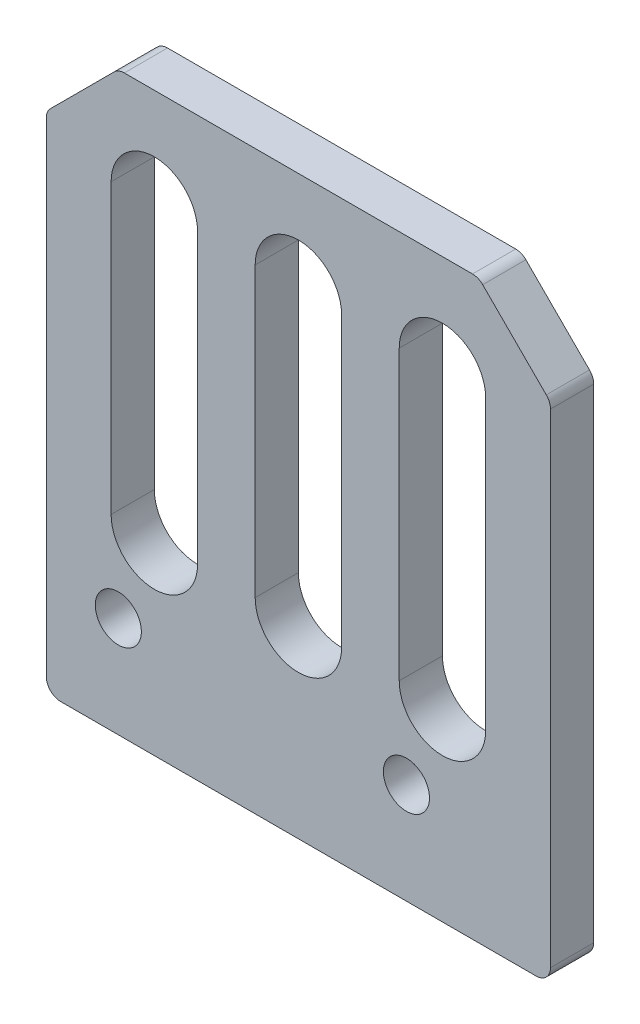
ISO-10303-21;
HEADER;
FILE_DESCRIPTION(('STEP AP214'),'2;1');
FILE_NAME('part.step','',(''),(''),'','','');
FILE_SCHEMA(('AUTOMOTIVE_DESIGN { 1 0 10303 214 1 1 1 1 }'));
ENDSEC;
DATA;
#1=APPLICATION_CONTEXT('core data for automotive mechanical design processes');
#2=APPLICATION_PROTOCOL_DEFINITION('international standard','automotive_design',2000,#1);
#3=PRODUCT_CONTEXT('',#1,'mechanical');
#4=PRODUCT('Part','Part','',(#3));
#5=PRODUCT_RELATED_PRODUCT_CATEGORY('part','',(#4));
#6=PRODUCT_DEFINITION_FORMATION('','',#4);
#7=PRODUCT_DEFINITION_CONTEXT('part definition',#1,'design');
#8=PRODUCT_DEFINITION('design','',#6,#7);
#9=PRODUCT_DEFINITION_SHAPE('','',#8);
#10=(LENGTH_UNIT() NAMED_UNIT(*) SI_UNIT(.MILLI.,.METRE.));
#11=(NAMED_UNIT(*) PLANE_ANGLE_UNIT() SI_UNIT($,.RADIAN.));
#12=(NAMED_UNIT(*) SI_UNIT($,.STERADIAN.) SOLID_ANGLE_UNIT());
#13=UNCERTAINTY_MEASURE_WITH_UNIT(LENGTH_MEASURE(1.E-05),#10,'distance_accuracy_value','');
#14=(GEOMETRIC_REPRESENTATION_CONTEXT(3) GLOBAL_UNCERTAINTY_ASSIGNED_CONTEXT((#13)) GLOBAL_UNIT_ASSIGNED_CONTEXT((#10,
#11,#12)) REPRESENTATION_CONTEXT('',''));
#15=CARTESIAN_POINT('',(0.,0.,0.));
#16=DIRECTION('',(0.,0.,1.));
#17=DIRECTION('',(1.,0.,0.));
#18=AXIS2_PLACEMENT_3D('',#15,#16,#17);
#19=CARTESIAN_POINT('',(17.5,20.,3.));
#20=DIRECTION('',(-1.,0.,0.));
#21=DIRECTION('',(0.,-1.,0.));
#22=AXIS2_PLACEMENT_3D('',#19,#20,#21);
#23=PLANE('',#22);
#24=DIRECTION('',(0.,1.,0.));
#25=VECTOR('',#24,1.);
#26=CARTESIAN_POINT('',(17.5,20.,0.));
#27=LINE('',#26,#25);
#28=CARTESIAN_POINT('',(17.5,-19.,0.));
#29=VERTEX_POINT('',#28);
#30=CARTESIAN_POINT('',(17.5,14.5857864376269,0.));
#31=VERTEX_POINT('',#30);
#32=EDGE_CURVE('E346',#29,#31,#27,.T.);
#33=ORIENTED_EDGE('',*,*,#32,.T.);
#34=DIRECTION('',(0.,0.,-1.));
#35=VECTOR('',#34,1.);
#36=CARTESIAN_POINT('',(17.5,14.5857864376269,3.));
#37=LINE('',#36,#35);
#38=CARTESIAN_POINT('',(17.5,14.5857864376269,3.));
#39=VERTEX_POINT('',#38);
#40=EDGE_CURVE('E459',#31,#39,#37,.F.);
#41=ORIENTED_EDGE('',*,*,#40,.T.);
#42=DIRECTION('',(0.,1.,0.));
#43=VECTOR('',#42,1.);
#44=CARTESIAN_POINT('',(17.5,20.,3.));
#45=LINE('',#44,#43);
#46=CARTESIAN_POINT('',(17.5,-19.,3.));
#47=VERTEX_POINT('',#46);
#48=EDGE_CURVE('E358',#47,#39,#45,.T.);
#49=ORIENTED_EDGE('',*,*,#48,.F.);
#50=DIRECTION('',(0.,0.,-1.));
#51=VECTOR('',#50,1.);
#52=CARTESIAN_POINT('',(17.5,-19.,3.));
#53=LINE('',#52,#51);
#54=EDGE_CURVE('E455',#47,#29,#53,.T.);
#55=ORIENTED_EDGE('',*,*,#54,.T.);
#56=EDGE_LOOP('',(#33,#41,#49,#55));
#57=FACE_BOUND('',#56,.T.);
#58=ADVANCED_FACE('F42',(#57),#23,.F.);
#59=CARTESIAN_POINT('',(-17.5,20.,3.));
#60=DIRECTION('',(0.,-1.,0.));
#61=DIRECTION('',(0.,0.,-1.));
#62=AXIS2_PLACEMENT_3D('',#59,#60,#61);
#63=PLANE('',#62);
#64=DIRECTION('',(-1.,0.,0.));
#65=VECTOR('',#64,1.);
#66=CARTESIAN_POINT('',(-17.5,20.,3.));
#67=LINE('',#66,#65);
#68=CARTESIAN_POINT('',(12.0857864376269,20.,3.));
#69=VERTEX_POINT('',#68);
#70=CARTESIAN_POINT('',(-12.0857864376269,20.,3.));
#71=VERTEX_POINT('',#70);
#72=EDGE_CURVE('E362',#69,#71,#67,.T.);
#73=ORIENTED_EDGE('',*,*,#72,.F.);
#74=DIRECTION('',(0.,0.,1.));
#75=VECTOR('',#74,1.);
#76=CARTESIAN_POINT('',(12.0857864376269,20.,0.));
#77=LINE('',#76,#75);
#78=CARTESIAN_POINT('',(12.0857864376269,20.,0.));
#79=VERTEX_POINT('',#78);
#80=EDGE_CURVE('E409',#69,#79,#77,.F.);
#81=ORIENTED_EDGE('',*,*,#80,.T.);
#82=DIRECTION('',(-1.,0.,0.));
#83=VECTOR('',#82,1.);
#84=CARTESIAN_POINT('',(-17.5,20.,0.));
#85=LINE('',#84,#83);
#86=CARTESIAN_POINT('',(-12.0857864376269,20.,0.));
#87=VERTEX_POINT('',#86);
#88=EDGE_CURVE('E379',#79,#87,#85,.T.);
#89=ORIENTED_EDGE('',*,*,#88,.T.);
#90=DIRECTION('',(0.,0.,-1.));
#91=VECTOR('',#90,1.);
#92=CARTESIAN_POINT('',(-12.0857864376269,20.,3.));
#93=LINE('',#92,#91);
#94=EDGE_CURVE('E405',#87,#71,#93,.F.);
#95=ORIENTED_EDGE('',*,*,#94,.T.);
#96=EDGE_LOOP('',(#73,#81,#89,#95));
#97=FACE_BOUND('',#96,.T.);
#98=ADVANCED_FACE('F493',(#97),#63,.F.);
#99=CARTESIAN_POINT('',(-17.5,20.,3.));
#100=DIRECTION('',(1.,0.,0.));
#101=DIRECTION('',(0.,1.,0.));
#102=AXIS2_PLACEMENT_3D('',#99,#100,#101);
#103=PLANE('',#102);
#104=DIRECTION('',(0.,-1.,0.));
#105=VECTOR('',#104,1.);
#106=CARTESIAN_POINT('',(-17.5,20.,3.));
#107=LINE('',#106,#105);
#108=CARTESIAN_POINT('',(-17.5,14.5857864376269,3.));
#109=VERTEX_POINT('',#108);
#110=CARTESIAN_POINT('',(-17.5,-19.,3.));
#111=VERTEX_POINT('',#110);
#112=EDGE_CURVE('E367',#109,#111,#107,.T.);
#113=ORIENTED_EDGE('',*,*,#112,.F.);
#114=DIRECTION('',(0.,0.,1.));
#115=VECTOR('',#114,1.);
#116=CARTESIAN_POINT('',(-17.5,14.5857864376269,0.));
#117=LINE('',#116,#115);
#118=CARTESIAN_POINT('',(-17.5,14.5857864376269,0.));
#119=VERTEX_POINT('',#118);
#120=EDGE_CURVE('E473',#109,#119,#117,.F.);
#121=ORIENTED_EDGE('',*,*,#120,.T.);
#122=DIRECTION('',(0.,-1.,0.));
#123=VECTOR('',#122,1.);
#124=CARTESIAN_POINT('',(-17.5,20.,0.));
#125=LINE('',#124,#123);
#126=CARTESIAN_POINT('',(-17.5,-19.,0.));
#127=VERTEX_POINT('',#126);
#128=EDGE_CURVE('E383',#119,#127,#125,.T.);
#129=ORIENTED_EDGE('',*,*,#128,.T.);
#130=DIRECTION('',(0.,0.,-1.));
#131=VECTOR('',#130,1.);
#132=CARTESIAN_POINT('',(-17.5,-19.,3.));
#133=LINE('',#132,#131);
#134=EDGE_CURVE('E470',#127,#111,#133,.F.);
#135=ORIENTED_EDGE('',*,*,#134,.T.);
#136=EDGE_LOOP('',(#113,#121,#129,#135));
#137=FACE_BOUND('',#136,.T.);
#138=ADVANCED_FACE('F528',(#137),#103,.F.);
#139=CARTESIAN_POINT('',(-17.5,-20.,3.));
#140=DIRECTION('',(0.,1.,0.));
#141=DIRECTION('',(0.,0.,1.));
#142=AXIS2_PLACEMENT_3D('',#139,#140,#141);
#143=PLANE('',#142);
#144=DIRECTION('',(1.,0.,0.));
#145=VECTOR('',#144,1.);
#146=CARTESIAN_POINT('',(-17.5,-20.,0.));
#147=LINE('',#146,#145);
#148=CARTESIAN_POINT('',(-16.5,-20.,0.));
#149=VERTEX_POINT('',#148);
#150=CARTESIAN_POINT('',(16.5,-20.,0.));
#151=VERTEX_POINT('',#150);
#152=EDGE_CURVE('E363',#149,#151,#147,.T.);
#153=ORIENTED_EDGE('',*,*,#152,.T.);
#154=DIRECTION('',(0.,0.,-1.));
#155=VECTOR('',#154,1.);
#156=CARTESIAN_POINT('',(16.5,-20.,3.));
#157=LINE('',#156,#155);
#158=CARTESIAN_POINT('',(16.5,-20.,3.));
#159=VERTEX_POINT('',#158);
#160=EDGE_CURVE('E467',#151,#159,#157,.F.);
#161=ORIENTED_EDGE('',*,*,#160,.T.);
#162=DIRECTION('',(1.,0.,0.));
#163=VECTOR('',#162,1.);
#164=CARTESIAN_POINT('',(-17.5,-20.,3.));
#165=LINE('',#164,#163);
#166=CARTESIAN_POINT('',(-16.5,-20.,3.));
#167=VERTEX_POINT('',#166);
#168=EDGE_CURVE('E371',#167,#159,#165,.T.);
#169=ORIENTED_EDGE('',*,*,#168,.F.);
#170=DIRECTION('',(0.,0.,-1.));
#171=VECTOR('',#170,1.);
#172=CARTESIAN_POINT('',(-16.5,-20.,3.));
#173=LINE('',#172,#171);
#174=EDGE_CURVE('E463',#167,#149,#173,.T.);
#175=ORIENTED_EDGE('',*,*,#174,.T.);
#176=EDGE_LOOP('',(#153,#161,#169,#175));
#177=FACE_BOUND('',#176,.T.);
#178=ADVANCED_FACE('F520',(#177),#143,.F.);
#179=CARTESIAN_POINT('',(0.,0.,3.));
#180=DIRECTION('',(0.,0.,1.));
#181=DIRECTION('',(1.,0.,0.));
#182=AXIS2_PLACEMENT_3D('',#179,#180,#181);
#183=PLANE('',#182);
#184=CARTESIAN_POINT('',(10.,13.,3.));
#185=DIRECTION('',(0.,0.,1.));
#186=DIRECTION('',(1.,0.,0.));
#187=AXIS2_PLACEMENT_3D('',#184,#185,#186);
#188=CIRCLE('',#187,3.00000000000001);
#189=CARTESIAN_POINT('',(13.,13.,3.));
#190=VERTEX_POINT('',#189);
#191=CARTESIAN_POINT('',(6.99999999999999,13.,3.));
#192=VERTEX_POINT('',#191);
#193=EDGE_CURVE('E58',#190,#192,#188,.T.);
#194=ORIENTED_EDGE('',*,*,#193,.F.);
#195=DIRECTION('',(0.,1.,0.));
#196=VECTOR('',#195,1.);
#197=CARTESIAN_POINT('',(13.,13.,3.));
#198=LINE('',#197,#196);
#199=CARTESIAN_POINT('',(13.,-7.,3.));
#200=VERTEX_POINT('',#199);
#201=EDGE_CURVE('E262',#200,#190,#198,.T.);
#202=ORIENTED_EDGE('',*,*,#201,.F.);
#203=CARTESIAN_POINT('',(10.,-7.,3.));
#204=DIRECTION('',(0.,0.,1.));
#205=DIRECTION('',(1.,0.,0.));
#206=AXIS2_PLACEMENT_3D('',#203,#204,#205);
#207=CIRCLE('',#206,3.00000000000001);
#208=CARTESIAN_POINT('',(6.99999999999999,-7.,3.));
#209=VERTEX_POINT('',#208);
#210=EDGE_CURVE('E281',#209,#200,#207,.T.);
#211=ORIENTED_EDGE('',*,*,#210,.F.);
#212=DIRECTION('',(0.,-1.,0.));
#213=VECTOR('',#212,1.);
#214=CARTESIAN_POINT('',(6.99999999999999,13.,3.));
#215=LINE('',#214,#213);
#216=EDGE_CURVE('E277',#192,#209,#215,.T.);
#217=ORIENTED_EDGE('',*,*,#216,.F.);
#218=EDGE_LOOP('',(#194,#202,#211,#217));
#219=FACE_BOUND('',#218,.T.);
#220=CARTESIAN_POINT('',(-10.,13.,3.));
#221=DIRECTION('',(0.,0.,1.));
#222=DIRECTION('',(1.,0.,0.));
#223=AXIS2_PLACEMENT_3D('',#220,#221,#222);
#224=CIRCLE('',#223,3.);
#225=CARTESIAN_POINT('',(-7.,13.,3.));
#226=VERTEX_POINT('',#225);
#227=CARTESIAN_POINT('',(-13.,13.,3.));
#228=VERTEX_POINT('',#227);
#229=EDGE_CURVE('E66',#226,#228,#224,.T.);
#230=ORIENTED_EDGE('',*,*,#229,.F.);
#231=DIRECTION('',(0.,1.,0.));
#232=VECTOR('',#231,1.);
#233=CARTESIAN_POINT('',(-7.,13.,3.));
#234=LINE('',#233,#232);
#235=CARTESIAN_POINT('',(-7.,-7.,3.));
#236=VERTEX_POINT('',#235);
#237=EDGE_CURVE('E227',#236,#226,#234,.T.);
#238=ORIENTED_EDGE('',*,*,#237,.F.);
#239=CARTESIAN_POINT('',(-10.,-7.,3.));
#240=DIRECTION('',(0.,0.,1.));
#241=DIRECTION('',(1.,0.,0.));
#242=AXIS2_PLACEMENT_3D('',#239,#240,#241);
#243=CIRCLE('',#242,3.);
#244=CARTESIAN_POINT('',(-13.,-7.,3.));
#245=VERTEX_POINT('',#244);
#246=EDGE_CURVE('E232',#245,#236,#243,.T.);
#247=ORIENTED_EDGE('',*,*,#246,.F.);
#248=DIRECTION('',(0.,-1.,0.));
#249=VECTOR('',#248,1.);
#250=CARTESIAN_POINT('',(-13.,13.,3.));
#251=LINE('',#250,#249);
#252=EDGE_CURVE('E241',#228,#245,#251,.T.);
#253=ORIENTED_EDGE('',*,*,#252,.F.);
#254=EDGE_LOOP('',(#230,#238,#247,#253));
#255=FACE_BOUND('',#254,.T.);
#256=CARTESIAN_POINT('',(0.,13.,3.));
#257=DIRECTION('',(0.,0.,1.));
#258=DIRECTION('',(1.,0.,0.));
#259=AXIS2_PLACEMENT_3D('',#256,#257,#258);
#260=CIRCLE('',#259,3.);
#261=CARTESIAN_POINT('',(3.,13.,3.));
#262=VERTEX_POINT('',#261);
#263=CARTESIAN_POINT('',(-3.,13.,3.));
#264=VERTEX_POINT('',#263);
#265=EDGE_CURVE('E251',#262,#264,#260,.T.);
#266=ORIENTED_EDGE('',*,*,#265,.F.);
#267=DIRECTION('',(0.,1.,0.));
#268=VECTOR('',#267,1.);
#269=CARTESIAN_POINT('',(3.,13.,3.));
#270=LINE('',#269,#268);
#271=CARTESIAN_POINT('',(3.,-7.,3.));
#272=VERTEX_POINT('',#271);
#273=EDGE_CURVE('E303',#272,#262,#270,.T.);
#274=ORIENTED_EDGE('',*,*,#273,.F.);
#275=CARTESIAN_POINT('',(0.,-7.,3.));
#276=DIRECTION('',(0.,0.,1.));
#277=DIRECTION('',(1.,0.,0.));
#278=AXIS2_PLACEMENT_3D('',#275,#276,#277);
#279=CIRCLE('',#278,3.);
#280=CARTESIAN_POINT('',(-3.,-7.,3.));
#281=VERTEX_POINT('',#280);
#282=EDGE_CURVE('E322',#281,#272,#279,.T.);
#283=ORIENTED_EDGE('',*,*,#282,.F.);
#284=DIRECTION('',(0.,-1.,0.));
#285=VECTOR('',#284,1.);
#286=CARTESIAN_POINT('',(-3.,13.,3.));
#287=LINE('',#286,#285);
#288=EDGE_CURVE('E318',#264,#281,#287,.T.);
#289=ORIENTED_EDGE('',*,*,#288,.F.);
#290=EDGE_LOOP('',(#266,#274,#283,#289));
#291=FACE_BOUND('',#290,.T.);
#292=CARTESIAN_POINT('',(-12.5,-13.,3.));
#293=DIRECTION('',(0.,0.,1.));
#294=DIRECTION('',(1.,0.,0.));
#295=AXIS2_PLACEMENT_3D('',#292,#293,#294);
#296=CIRCLE('',#295,1.6);
#297=CARTESIAN_POINT('',(-10.9,-13.,3.));
#298=VERTEX_POINT('',#297);
#299=EDGE_CURVE('E347',#298,#298,#296,.T.);
#300=ORIENTED_EDGE('',*,*,#299,.F.);
#301=EDGE_LOOP('',(#300));
#302=FACE_BOUND('',#301,.T.);
#303=CARTESIAN_POINT('',(7.5,-13.,3.));
#304=DIRECTION('',(0.,0.,1.));
#305=DIRECTION('',(1.,0.,0.));
#306=AXIS2_PLACEMENT_3D('',#303,#304,#305);
#307=CIRCLE('',#306,1.6);
#308=CARTESIAN_POINT('',(9.1,-13.,3.));
#309=VERTEX_POINT('',#308);
#310=EDGE_CURVE('E332',#309,#309,#307,.T.);
#311=ORIENTED_EDGE('',*,*,#310,.F.);
#312=EDGE_LOOP('',(#311));
#313=FACE_BOUND('',#312,.T.);
#314=DIRECTION('',(0.707106781186546,-0.707106781186549,0.));
#315=VECTOR('',#314,1.);
#316=CARTESIAN_POINT('',(16.25,16.25,3.));
#317=LINE('',#316,#315);
#318=CARTESIAN_POINT('',(17.2071067811865,15.2928932188134,3.));
#319=VERTEX_POINT('',#318);
#320=CARTESIAN_POINT('',(12.7928932188135,19.7071067811865,3.));
#321=VERTEX_POINT('',#320);
#322=EDGE_CURVE('E397',#319,#321,#317,.F.);
#323=ORIENTED_EDGE('',*,*,#322,.T.);
#324=CARTESIAN_POINT('',(12.0857864376269,19.,3.));
#325=DIRECTION('',(0.,0.,1.));
#326=DIRECTION('',(1.,0.,0.));
#327=AXIS2_PLACEMENT_3D('',#324,#325,#326);
#328=CIRCLE('',#327,1.);
#329=EDGE_CURVE('E452',#321,#69,#328,.T.);
#330=ORIENTED_EDGE('',*,*,#329,.T.);
#331=ORIENTED_EDGE('',*,*,#72,.T.);
#332=CARTESIAN_POINT('',(-12.0857864376269,19.,3.));
#333=DIRECTION('',(0.,0.,1.));
#334=DIRECTION('',(1.,0.,0.));
#335=AXIS2_PLACEMENT_3D('',#332,#333,#334);
#336=CIRCLE('',#335,1.);
#337=CARTESIAN_POINT('',(-12.7928932188134,19.7071067811865,3.));
#338=VERTEX_POINT('',#337);
#339=EDGE_CURVE('E440',#71,#338,#336,.T.);
#340=ORIENTED_EDGE('',*,*,#339,.T.);
#341=DIRECTION('',(0.707106781186549,0.707106781186546,0.));
#342=VECTOR('',#341,1.);
#343=CARTESIAN_POINT('',(-16.25,16.25,3.));
#344=LINE('',#343,#342);
#345=CARTESIAN_POINT('',(-17.2071067811865,15.2928932188134,3.));
#346=VERTEX_POINT('',#345);
#347=EDGE_CURVE('E401',#338,#346,#344,.F.);
#348=ORIENTED_EDGE('',*,*,#347,.T.);
#349=CARTESIAN_POINT('',(-16.5,14.5857864376269,3.));
#350=DIRECTION('',(0.,0.,1.));
#351=DIRECTION('',(1.,0.,0.));
#352=AXIS2_PLACEMENT_3D('',#349,#350,#351);
#353=CIRCLE('',#352,1.);
#354=EDGE_CURVE('E443',#346,#109,#353,.T.);
#355=ORIENTED_EDGE('',*,*,#354,.T.);
#356=ORIENTED_EDGE('',*,*,#112,.T.);
#357=CARTESIAN_POINT('',(-16.5,-19.,3.));
#358=DIRECTION('',(0.,0.,1.));
#359=DIRECTION('',(1.,0.,0.));
#360=AXIS2_PLACEMENT_3D('',#357,#358,#359);
#361=CIRCLE('',#360,1.);
#362=EDGE_CURVE('E437',#111,#167,#361,.T.);
#363=ORIENTED_EDGE('',*,*,#362,.T.);
#364=ORIENTED_EDGE('',*,*,#168,.T.);
#365=CARTESIAN_POINT('',(16.5,-19.,3.));
#366=DIRECTION('',(0.,0.,1.));
#367=DIRECTION('',(1.,0.,0.));
#368=AXIS2_PLACEMENT_3D('',#365,#366,#367);
#369=CIRCLE('',#368,1.);
#370=EDGE_CURVE('E446',#159,#47,#369,.T.);
#371=ORIENTED_EDGE('',*,*,#370,.T.);
#372=ORIENTED_EDGE('',*,*,#48,.T.);
#373=CARTESIAN_POINT('',(16.5,14.5857864376269,3.));
#374=DIRECTION('',(0.,0.,1.));
#375=DIRECTION('',(1.,0.,0.));
#376=AXIS2_PLACEMENT_3D('',#373,#374,#375);
#377=CIRCLE('',#376,1.);
#378=EDGE_CURVE('E449',#39,#319,#377,.T.);
#379=ORIENTED_EDGE('',*,*,#378,.T.);
#380=EDGE_LOOP('',(#323,#330,#331,#340,#348,#355,#356,#363,#364,#371,#372,#379));
#381=FACE_BOUND('',#380,.T.);
#382=ADVANCED_FACE('F496',(#219,#255,#291,#302,#313,#381),#183,.T.);
#383=CARTESIAN_POINT('',(0.,0.,0.));
#384=DIRECTION('',(0.,0.,1.));
#385=DIRECTION('',(1.,0.,0.));
#386=AXIS2_PLACEMENT_3D('',#383,#384,#385);
#387=PLANE('',#386);
#388=DIRECTION('',(0.,1.,0.));
#389=VECTOR('',#388,1.);
#390=CARTESIAN_POINT('',(13.,13.,0.));
#391=LINE('',#390,#389);
#392=CARTESIAN_POINT('',(13.,-7.,0.));
#393=VERTEX_POINT('',#392);
#394=CARTESIAN_POINT('',(13.,13.,0.));
#395=VERTEX_POINT('',#394);
#396=EDGE_CURVE('E270',#393,#395,#391,.T.);
#397=ORIENTED_EDGE('',*,*,#396,.T.);
#398=CARTESIAN_POINT('',(10.,13.,0.));
#399=DIRECTION('',(0.,0.,1.));
#400=DIRECTION('',(1.,0.,0.));
#401=AXIS2_PLACEMENT_3D('',#398,#399,#400);
#402=CIRCLE('',#401,3.00000000000001);
#403=CARTESIAN_POINT('',(6.99999999999999,13.,0.));
#404=VERTEX_POINT('',#403);
#405=EDGE_CURVE('E257',#395,#404,#402,.T.);
#406=ORIENTED_EDGE('',*,*,#405,.T.);
#407=DIRECTION('',(0.,-1.,0.));
#408=VECTOR('',#407,1.);
#409=CARTESIAN_POINT('',(6.99999999999999,13.,0.));
#410=LINE('',#409,#408);
#411=CARTESIAN_POINT('',(6.99999999999999,-7.,0.));
#412=VERTEX_POINT('',#411);
#413=EDGE_CURVE('E261',#404,#412,#410,.T.);
#414=ORIENTED_EDGE('',*,*,#413,.T.);
#415=CARTESIAN_POINT('',(10.,-7.,0.));
#416=DIRECTION('',(0.,0.,1.));
#417=DIRECTION('',(1.,0.,0.));
#418=AXIS2_PLACEMENT_3D('',#415,#416,#417);
#419=CIRCLE('',#418,3.00000000000001);
#420=EDGE_CURVE('E266',#412,#393,#419,.T.);
#421=ORIENTED_EDGE('',*,*,#420,.T.);
#422=EDGE_LOOP('',(#397,#406,#414,#421));
#423=FACE_BOUND('',#422,.T.);
#424=DIRECTION('',(0.,1.,0.));
#425=VECTOR('',#424,1.);
#426=CARTESIAN_POINT('',(-7.,13.,0.));
#427=LINE('',#426,#425);
#428=CARTESIAN_POINT('',(-7.,-7.,0.));
#429=VERTEX_POINT('',#428);
#430=CARTESIAN_POINT('',(-7.,13.,0.));
#431=VERTEX_POINT('',#430);
#432=EDGE_CURVE('E212',#429,#431,#427,.T.);
#433=ORIENTED_EDGE('',*,*,#432,.T.);
#434=CARTESIAN_POINT('',(-10.,13.,0.));
#435=DIRECTION('',(0.,0.,1.));
#436=DIRECTION('',(1.,0.,0.));
#437=AXIS2_PLACEMENT_3D('',#434,#435,#436);
#438=CIRCLE('',#437,3.);
#439=CARTESIAN_POINT('',(-13.,13.,0.));
#440=VERTEX_POINT('',#439);
#441=EDGE_CURVE('E205',#431,#440,#438,.T.);
#442=ORIENTED_EDGE('',*,*,#441,.T.);
#443=DIRECTION('',(0.,-1.,0.));
#444=VECTOR('',#443,1.);
#445=CARTESIAN_POINT('',(-13.,13.,0.));
#446=LINE('',#445,#444);
#447=CARTESIAN_POINT('',(-13.,-7.,0.));
#448=VERTEX_POINT('',#447);
#449=EDGE_CURVE('E216',#440,#448,#446,.T.);
#450=ORIENTED_EDGE('',*,*,#449,.T.);
#451=CARTESIAN_POINT('',(-10.,-7.,0.));
#452=DIRECTION('',(0.,0.,1.));
#453=DIRECTION('',(1.,0.,0.));
#454=AXIS2_PLACEMENT_3D('',#451,#452,#453);
#455=CIRCLE('',#454,3.);
#456=EDGE_CURVE('E221',#448,#429,#455,.T.);
#457=ORIENTED_EDGE('',*,*,#456,.T.);
#458=EDGE_LOOP('',(#433,#442,#450,#457));
#459=FACE_BOUND('',#458,.T.);
#460=DIRECTION('',(0.,1.,0.));
#461=VECTOR('',#460,1.);
#462=CARTESIAN_POINT('',(3.,13.,0.));
#463=LINE('',#462,#461);
#464=CARTESIAN_POINT('',(3.,-7.,0.));
#465=VERTEX_POINT('',#464);
#466=CARTESIAN_POINT('',(3.,13.,0.));
#467=VERTEX_POINT('',#466);
#468=EDGE_CURVE('E311',#465,#467,#463,.T.);
#469=ORIENTED_EDGE('',*,*,#468,.T.);
#470=CARTESIAN_POINT('',(0.,13.,0.));
#471=DIRECTION('',(0.,0.,1.));
#472=DIRECTION('',(1.,0.,0.));
#473=AXIS2_PLACEMENT_3D('',#470,#471,#472);
#474=CIRCLE('',#473,3.);
#475=CARTESIAN_POINT('',(-3.,13.,0.));
#476=VERTEX_POINT('',#475);
#477=EDGE_CURVE('E298',#467,#476,#474,.T.);
#478=ORIENTED_EDGE('',*,*,#477,.T.);
#479=DIRECTION('',(0.,-1.,0.));
#480=VECTOR('',#479,1.);
#481=CARTESIAN_POINT('',(-3.,13.,0.));
#482=LINE('',#481,#480);
#483=CARTESIAN_POINT('',(-3.,-7.,0.));
#484=VERTEX_POINT('',#483);
#485=EDGE_CURVE('E302',#476,#484,#482,.T.);
#486=ORIENTED_EDGE('',*,*,#485,.T.);
#487=CARTESIAN_POINT('',(0.,-7.,0.));
#488=DIRECTION('',(0.,0.,1.));
#489=DIRECTION('',(1.,0.,0.));
#490=AXIS2_PLACEMENT_3D('',#487,#488,#489);
#491=CIRCLE('',#490,3.);
#492=EDGE_CURVE('E307',#484,#465,#491,.T.);
#493=ORIENTED_EDGE('',*,*,#492,.T.);
#494=EDGE_LOOP('',(#469,#478,#486,#493));
#495=FACE_BOUND('',#494,.T.);
#496=CARTESIAN_POINT('',(-12.5,-13.,0.));
#497=DIRECTION('',(0.,0.,1.));
#498=DIRECTION('',(1.,0.,0.));
#499=AXIS2_PLACEMENT_3D('',#496,#497,#498);
#500=CIRCLE('',#499,1.6);
#501=CARTESIAN_POINT('',(-10.9,-13.,0.));
#502=VERTEX_POINT('',#501);
#503=EDGE_CURVE('E342',#502,#502,#500,.T.);
#504=ORIENTED_EDGE('',*,*,#503,.T.);
#505=EDGE_LOOP('',(#504));
#506=FACE_BOUND('',#505,.T.);
#507=CARTESIAN_POINT('',(7.5,-13.,0.));
#508=DIRECTION('',(0.,0.,1.));
#509=DIRECTION('',(1.,0.,0.));
#510=AXIS2_PLACEMENT_3D('',#507,#508,#509);
#511=CIRCLE('',#510,1.6);
#512=CARTESIAN_POINT('',(9.1,-13.,0.));
#513=VERTEX_POINT('',#512);
#514=EDGE_CURVE('E351',#513,#513,#511,.T.);
#515=ORIENTED_EDGE('',*,*,#514,.T.);
#516=EDGE_LOOP('',(#515));
#517=FACE_BOUND('',#516,.T.);
#518=ORIENTED_EDGE('',*,*,#88,.F.);
#519=CARTESIAN_POINT('',(12.0857864376269,19.,0.));
#520=DIRECTION('',(0.,0.,1.));
#521=DIRECTION('',(1.,0.,0.));
#522=AXIS2_PLACEMENT_3D('',#519,#520,#521);
#523=CIRCLE('',#522,1.);
#524=CARTESIAN_POINT('',(12.7928932188135,19.7071067811865,0.));
#525=VERTEX_POINT('',#524);
#526=EDGE_CURVE('E428',#79,#525,#523,.F.);
#527=ORIENTED_EDGE('',*,*,#526,.T.);
#528=DIRECTION('',(-0.707106781186546,0.707106781186549,0.));
#529=VECTOR('',#528,1.);
#530=CARTESIAN_POINT('',(12.5,20.,0.));
#531=LINE('',#530,#529);
#532=CARTESIAN_POINT('',(17.2071067811865,15.2928932188134,0.));
#533=VERTEX_POINT('',#532);
#534=EDGE_CURVE('E375',#525,#533,#531,.F.);
#535=ORIENTED_EDGE('',*,*,#534,.T.);
#536=CARTESIAN_POINT('',(16.5,14.5857864376269,0.));
#537=DIRECTION('',(0.,0.,1.));
#538=DIRECTION('',(1.,0.,0.));
#539=AXIS2_PLACEMENT_3D('',#536,#537,#538);
#540=CIRCLE('',#539,1.);
#541=EDGE_CURVE('E425',#533,#31,#540,.F.);
#542=ORIENTED_EDGE('',*,*,#541,.T.);
#543=ORIENTED_EDGE('',*,*,#32,.F.);
#544=CARTESIAN_POINT('',(16.5,-19.,0.));
#545=DIRECTION('',(0.,0.,1.));
#546=DIRECTION('',(1.,0.,0.));
#547=AXIS2_PLACEMENT_3D('',#544,#545,#546);
#548=CIRCLE('',#547,1.);
#549=EDGE_CURVE('E422',#29,#151,#548,.F.);
#550=ORIENTED_EDGE('',*,*,#549,.T.);
#551=ORIENTED_EDGE('',*,*,#152,.F.);
#552=CARTESIAN_POINT('',(-16.5,-19.,0.));
#553=DIRECTION('',(0.,0.,1.));
#554=DIRECTION('',(1.,0.,0.));
#555=AXIS2_PLACEMENT_3D('',#552,#553,#554);
#556=CIRCLE('',#555,1.);
#557=EDGE_CURVE('E413',#149,#127,#556,.F.);
#558=ORIENTED_EDGE('',*,*,#557,.T.);
#559=ORIENTED_EDGE('',*,*,#128,.F.);
#560=CARTESIAN_POINT('',(-16.5,14.5857864376269,0.));
#561=DIRECTION('',(0.,0.,1.));
#562=DIRECTION('',(1.,0.,0.));
#563=AXIS2_PLACEMENT_3D('',#560,#561,#562);
#564=CIRCLE('',#563,1.);
#565=CARTESIAN_POINT('',(-17.2071067811865,15.2928932188134,0.));
#566=VERTEX_POINT('',#565);
#567=EDGE_CURVE('E419',#119,#566,#564,.F.);
#568=ORIENTED_EDGE('',*,*,#567,.T.);
#569=DIRECTION('',(-0.707106781186549,-0.707106781186546,0.));
#570=VECTOR('',#569,1.);
#571=CARTESIAN_POINT('',(-17.5,15.,0.));
#572=LINE('',#571,#570);
#573=CARTESIAN_POINT('',(-12.7928932188134,19.7071067811865,0.));
#574=VERTEX_POINT('',#573);
#575=EDGE_CURVE('E393',#566,#574,#572,.F.);
#576=ORIENTED_EDGE('',*,*,#575,.T.);
#577=CARTESIAN_POINT('',(-12.0857864376269,19.,0.));
#578=DIRECTION('',(0.,0.,1.));
#579=DIRECTION('',(1.,0.,0.));
#580=AXIS2_PLACEMENT_3D('',#577,#578,#579);
#581=CIRCLE('',#580,1.);
#582=EDGE_CURVE('E416',#574,#87,#581,.F.);
#583=ORIENTED_EDGE('',*,*,#582,.T.);
#584=EDGE_LOOP('',(#518,#527,#535,#542,#543,#550,#551,#558,#559,#568,#576,#583));
#585=FACE_BOUND('',#584,.T.);
#586=ADVANCED_FACE('F223',(#423,#459,#495,#506,#517,#585),#387,.F.);
#587=CARTESIAN_POINT('',(-17.5,15.,3.));
#588=DIRECTION('',(0.707106781186546,-0.707106781186549,0.));
#589=DIRECTION('',(0.,0.,-1.));
#590=AXIS2_PLACEMENT_3D('',#587,#588,#589);
#591=PLANE('',#590);
#592=ORIENTED_EDGE('',*,*,#575,.F.);
#593=DIRECTION('',(0.,0.,-1.));
#594=VECTOR('',#593,1.);
#595=CARTESIAN_POINT('',(-17.2071067811865,15.2928932188134,3.));
#596=LINE('',#595,#594);
#597=EDGE_CURVE('E11',#566,#346,#596,.F.);
#598=ORIENTED_EDGE('',*,*,#597,.T.);
#599=ORIENTED_EDGE('',*,*,#347,.F.);
#600=DIRECTION('',(0.,0.,1.));
#601=VECTOR('',#600,1.);
#602=CARTESIAN_POINT('',(-12.7928932188134,19.7071067811865,0.));
#603=LINE('',#602,#601);
#604=EDGE_CURVE('E51',#338,#574,#603,.F.);
#605=ORIENTED_EDGE('',*,*,#604,.T.);
#606=EDGE_LOOP('',(#592,#598,#599,#605));
#607=FACE_BOUND('',#606,.T.);
#608=ADVANCED_FACE('F482',(#607),#591,.F.);
#609=CARTESIAN_POINT('',(12.5,20.,3.));
#610=DIRECTION('',(-0.707106781186549,-0.707106781186546,0.));
#611=DIRECTION('',(0.,0.,-1.));
#612=AXIS2_PLACEMENT_3D('',#609,#610,#611);
#613=PLANE('',#612);
#614=ORIENTED_EDGE('',*,*,#534,.F.);
#615=DIRECTION('',(0.,0.,-1.));
#616=VECTOR('',#615,1.);
#617=CARTESIAN_POINT('',(12.7928932188135,19.7071067811865,3.));
#618=LINE('',#617,#616);
#619=EDGE_CURVE('E434',#525,#321,#618,.F.);
#620=ORIENTED_EDGE('',*,*,#619,.T.);
#621=ORIENTED_EDGE('',*,*,#322,.F.);
#622=DIRECTION('',(0.,0.,1.));
#623=VECTOR('',#622,1.);
#624=CARTESIAN_POINT('',(17.2071067811865,15.2928932188134,0.));
#625=LINE('',#624,#623);
#626=EDGE_CURVE('E431',#319,#533,#625,.F.);
#627=ORIENTED_EDGE('',*,*,#626,.T.);
#628=EDGE_LOOP('',(#614,#620,#621,#627));
#629=FACE_BOUND('',#628,.T.);
#630=ADVANCED_FACE('F505',(#629),#613,.F.);
#631=CARTESIAN_POINT('',(12.0857864376269,19.,3.));
#632=DIRECTION('',(0.,0.,-1.));
#633=DIRECTION('',(-1.,0.,0.));
#634=AXIS2_PLACEMENT_3D('',#631,#632,#633);
#635=CYLINDRICAL_SURFACE('',#634,1.);
#636=ORIENTED_EDGE('',*,*,#329,.F.);
#637=ORIENTED_EDGE('',*,*,#619,.F.);
#638=ORIENTED_EDGE('',*,*,#526,.F.);
#639=ORIENTED_EDGE('',*,*,#80,.F.);
#640=EDGE_LOOP('',(#636,#637,#638,#639));
#641=FACE_BOUND('',#640,.T.);
#642=ADVANCED_FACE('F501',(#641),#635,.T.);
#643=CARTESIAN_POINT('',(16.5,14.5857864376269,3.));
#644=DIRECTION('',(0.,0.,1.));
#645=DIRECTION('',(1.,0.,0.));
#646=AXIS2_PLACEMENT_3D('',#643,#644,#645);
#647=CYLINDRICAL_SURFACE('',#646,1.);
#648=ORIENTED_EDGE('',*,*,#541,.F.);
#649=ORIENTED_EDGE('',*,*,#626,.F.);
#650=ORIENTED_EDGE('',*,*,#378,.F.);
#651=ORIENTED_EDGE('',*,*,#40,.F.);
#652=EDGE_LOOP('',(#648,#649,#650,#651));
#653=FACE_BOUND('',#652,.T.);
#654=ADVANCED_FACE('F508',(#653),#647,.T.);
#655=CARTESIAN_POINT('',(16.5,-19.,3.));
#656=DIRECTION('',(0.,0.,-1.));
#657=DIRECTION('',(-1.,0.,0.));
#658=AXIS2_PLACEMENT_3D('',#655,#656,#657);
#659=CYLINDRICAL_SURFACE('',#658,1.);
#660=ORIENTED_EDGE('',*,*,#370,.F.);
#661=ORIENTED_EDGE('',*,*,#160,.F.);
#662=ORIENTED_EDGE('',*,*,#549,.F.);
#663=ORIENTED_EDGE('',*,*,#54,.F.);
#664=EDGE_LOOP('',(#660,#661,#662,#663));
#665=FACE_BOUND('',#664,.T.);
#666=ADVANCED_FACE('F516',(#665),#659,.T.);
#667=CARTESIAN_POINT('',(-16.5,14.5857864376269,3.));
#668=DIRECTION('',(0.,0.,-1.));
#669=DIRECTION('',(-1.,0.,0.));
#670=AXIS2_PLACEMENT_3D('',#667,#668,#669);
#671=CYLINDRICAL_SURFACE('',#670,1.);
#672=ORIENTED_EDGE('',*,*,#354,.F.);
#673=ORIENTED_EDGE('',*,*,#597,.F.);
#674=ORIENTED_EDGE('',*,*,#567,.F.);
#675=ORIENTED_EDGE('',*,*,#120,.F.);
#676=EDGE_LOOP('',(#672,#673,#674,#675));
#677=FACE_BOUND('',#676,.T.);
#678=ADVANCED_FACE('F532',(#677),#671,.T.);
#679=CARTESIAN_POINT('',(-12.0857864376269,19.,3.));
#680=DIRECTION('',(0.,0.,1.));
#681=DIRECTION('',(1.,0.,0.));
#682=AXIS2_PLACEMENT_3D('',#679,#680,#681);
#683=CYLINDRICAL_SURFACE('',#682,1.);
#684=ORIENTED_EDGE('',*,*,#582,.F.);
#685=ORIENTED_EDGE('',*,*,#604,.F.);
#686=ORIENTED_EDGE('',*,*,#339,.F.);
#687=ORIENTED_EDGE('',*,*,#94,.F.);
#688=EDGE_LOOP('',(#684,#685,#686,#687));
#689=FACE_BOUND('',#688,.T.);
#690=ADVANCED_FACE('F490',(#689),#683,.T.);
#691=CARTESIAN_POINT('',(-16.5,-19.,3.));
#692=DIRECTION('',(0.,0.,-1.));
#693=DIRECTION('',(-1.,0.,0.));
#694=AXIS2_PLACEMENT_3D('',#691,#692,#693);
#695=CYLINDRICAL_SURFACE('',#694,1.);
#696=ORIENTED_EDGE('',*,*,#362,.F.);
#697=ORIENTED_EDGE('',*,*,#134,.F.);
#698=ORIENTED_EDGE('',*,*,#557,.F.);
#699=ORIENTED_EDGE('',*,*,#174,.F.);
#700=EDGE_LOOP('',(#696,#697,#698,#699));
#701=FACE_BOUND('',#700,.T.);
#702=ADVANCED_FACE('F44',(#701),#695,.T.);
#703=CARTESIAN_POINT('',(7.5,-13.,0.));
#704=DIRECTION('',(0.,0.,1.));
#705=DIRECTION('',(1.,0.,0.));
#706=AXIS2_PLACEMENT_3D('',#703,#704,#705);
#707=CYLINDRICAL_SURFACE('',#706,1.6);
#708=ORIENTED_EDGE('',*,*,#514,.F.);
#709=EDGE_LOOP('',(#708));
#710=FACE_BOUND('',#709,.T.);
#711=ORIENTED_EDGE('',*,*,#310,.T.);
#712=EDGE_LOOP('',(#711));
#713=FACE_BOUND('',#712,.T.);
#714=ADVANCED_FACE('F588',(#710,#713),#707,.F.);
#715=CARTESIAN_POINT('',(-12.5,-13.,0.));
#716=DIRECTION('',(0.,0.,1.));
#717=DIRECTION('',(1.,0.,0.));
#718=AXIS2_PLACEMENT_3D('',#715,#716,#717);
#719=CYLINDRICAL_SURFACE('',#718,1.6);
#720=ORIENTED_EDGE('',*,*,#503,.F.);
#721=EDGE_LOOP('',(#720));
#722=FACE_BOUND('',#721,.T.);
#723=ORIENTED_EDGE('',*,*,#299,.T.);
#724=EDGE_LOOP('',(#723));
#725=FACE_BOUND('',#724,.T.);
#726=ADVANCED_FACE('F596',(#722,#725),#719,.F.);
#727=CARTESIAN_POINT('',(0.,13.,0.));
#728=DIRECTION('',(0.,0.,1.));
#729=DIRECTION('',(1.,0.,0.));
#730=AXIS2_PLACEMENT_3D('',#727,#728,#729);
#731=CYLINDRICAL_SURFACE('',#730,3.);
#732=ORIENTED_EDGE('',*,*,#265,.T.);
#733=DIRECTION('',(0.,0.,1.));
#734=VECTOR('',#733,1.);
#735=CARTESIAN_POINT('',(-3.,13.,0.));
#736=LINE('',#735,#734);
#737=EDGE_CURVE('E315',#476,#264,#736,.T.);
#738=ORIENTED_EDGE('',*,*,#737,.F.);
#739=ORIENTED_EDGE('',*,*,#477,.F.);
#740=DIRECTION('',(0.,0.,1.));
#741=VECTOR('',#740,1.);
#742=CARTESIAN_POINT('',(3.,13.,0.));
#743=LINE('',#742,#741);
#744=EDGE_CURVE('E329',#467,#262,#743,.T.);
#745=ORIENTED_EDGE('',*,*,#744,.T.);
#746=EDGE_LOOP('',(#732,#738,#739,#745));
#747=FACE_BOUND('',#746,.T.);
#748=ADVANCED_FACE('F606',(#747),#731,.F.);
#749=CARTESIAN_POINT('',(3.,13.,0.));
#750=DIRECTION('',(1.,0.,0.));
#751=DIRECTION('',(0.,1.,0.));
#752=AXIS2_PLACEMENT_3D('',#749,#750,#751);
#753=PLANE('',#752);
#754=ORIENTED_EDGE('',*,*,#273,.T.);
#755=ORIENTED_EDGE('',*,*,#744,.F.);
#756=ORIENTED_EDGE('',*,*,#468,.F.);
#757=DIRECTION('',(0.,0.,1.));
#758=VECTOR('',#757,1.);
#759=CARTESIAN_POINT('',(3.,-7.,0.));
#760=LINE('',#759,#758);
#761=EDGE_CURVE('E333',#465,#272,#760,.T.);
#762=ORIENTED_EDGE('',*,*,#761,.T.);
#763=EDGE_LOOP('',(#754,#755,#756,#762));
#764=FACE_BOUND('',#763,.T.);
#765=ADVANCED_FACE('F617',(#764),#753,.F.);
#766=CARTESIAN_POINT('',(0.,-7.,0.));
#767=DIRECTION('',(0.,0.,1.));
#768=DIRECTION('',(1.,0.,0.));
#769=AXIS2_PLACEMENT_3D('',#766,#767,#768);
#770=CYLINDRICAL_SURFACE('',#769,3.);
#771=ORIENTED_EDGE('',*,*,#282,.T.);
#772=ORIENTED_EDGE('',*,*,#761,.F.);
#773=ORIENTED_EDGE('',*,*,#492,.F.);
#774=DIRECTION('',(0.,0.,1.));
#775=VECTOR('',#774,1.);
#776=CARTESIAN_POINT('',(-3.,-7.,0.));
#777=LINE('',#776,#775);
#778=EDGE_CURVE('E336',#484,#281,#777,.T.);
#779=ORIENTED_EDGE('',*,*,#778,.T.);
#780=EDGE_LOOP('',(#771,#772,#773,#779));
#781=FACE_BOUND('',#780,.T.);
#782=ADVANCED_FACE('F628',(#781),#770,.F.);
#783=CARTESIAN_POINT('',(-3.,13.,0.));
#784=DIRECTION('',(-1.,0.,0.));
#785=DIRECTION('',(0.,-1.,0.));
#786=AXIS2_PLACEMENT_3D('',#783,#784,#785);
#787=PLANE('',#786);
#788=ORIENTED_EDGE('',*,*,#288,.T.);
#789=ORIENTED_EDGE('',*,*,#778,.F.);
#790=ORIENTED_EDGE('',*,*,#485,.F.);
#791=ORIENTED_EDGE('',*,*,#737,.T.);
#792=EDGE_LOOP('',(#788,#789,#790,#791));
#793=FACE_BOUND('',#792,.T.);
#794=ADVANCED_FACE('F638',(#793),#787,.F.);
#795=CARTESIAN_POINT('',(-10.,13.,0.));
#796=DIRECTION('',(0.,0.,1.));
#797=DIRECTION('',(1.,0.,0.));
#798=AXIS2_PLACEMENT_3D('',#795,#796,#797);
#799=CYLINDRICAL_SURFACE('',#798,3.);
#800=ORIENTED_EDGE('',*,*,#229,.T.);
#801=DIRECTION('',(0.,0.,1.));
#802=VECTOR('',#801,1.);
#803=CARTESIAN_POINT('',(-13.,13.,0.));
#804=LINE('',#803,#802);
#805=EDGE_CURVE('E201',#440,#228,#804,.T.);
#806=ORIENTED_EDGE('',*,*,#805,.F.);
#807=ORIENTED_EDGE('',*,*,#441,.F.);
#808=DIRECTION('',(0.,0.,1.));
#809=VECTOR('',#808,1.);
#810=CARTESIAN_POINT('',(-7.,13.,0.));
#811=LINE('',#810,#809);
#812=EDGE_CURVE('E248',#431,#226,#811,.T.);
#813=ORIENTED_EDGE('',*,*,#812,.T.);
#814=EDGE_LOOP('',(#800,#806,#807,#813));
#815=FACE_BOUND('',#814,.T.);
#816=ADVANCED_FACE('F203',(#815),#799,.F.);
#817=CARTESIAN_POINT('',(-7.,13.,0.));
#818=DIRECTION('',(1.,0.,0.));
#819=DIRECTION('',(0.,0.,-1.));
#820=AXIS2_PLACEMENT_3D('',#817,#818,#819);
#821=PLANE('',#820);
#822=ORIENTED_EDGE('',*,*,#237,.T.);
#823=ORIENTED_EDGE('',*,*,#812,.F.);
#824=ORIENTED_EDGE('',*,*,#432,.F.);
#825=DIRECTION('',(0.,0.,1.));
#826=VECTOR('',#825,1.);
#827=CARTESIAN_POINT('',(-7.,-7.,0.));
#828=LINE('',#827,#826);
#829=EDGE_CURVE('E252',#429,#236,#828,.T.);
#830=ORIENTED_EDGE('',*,*,#829,.T.);
#831=EDGE_LOOP('',(#822,#823,#824,#830));
#832=FACE_BOUND('',#831,.T.);
#833=ADVANCED_FACE('F657',(#832),#821,.F.);
#834=CARTESIAN_POINT('',(-10.,-7.,0.));
#835=DIRECTION('',(0.,0.,1.));
#836=DIRECTION('',(1.,0.,0.));
#837=AXIS2_PLACEMENT_3D('',#834,#835,#836);
#838=CYLINDRICAL_SURFACE('',#837,3.);
#839=ORIENTED_EDGE('',*,*,#246,.T.);
#840=ORIENTED_EDGE('',*,*,#829,.F.);
#841=ORIENTED_EDGE('',*,*,#456,.F.);
#842=DIRECTION('',(0.,0.,1.));
#843=VECTOR('',#842,1.);
#844=CARTESIAN_POINT('',(-13.,-7.,0.));
#845=LINE('',#844,#843);
#846=EDGE_CURVE('E211',#448,#245,#845,.T.);
#847=ORIENTED_EDGE('',*,*,#846,.T.);
#848=EDGE_LOOP('',(#839,#840,#841,#847));
#849=FACE_BOUND('',#848,.T.);
#850=ADVANCED_FACE('F666',(#849),#838,.F.);
#851=CARTESIAN_POINT('',(-13.,13.,0.));
#852=DIRECTION('',(-1.,0.,0.));
#853=DIRECTION('',(0.,0.,1.));
#854=AXIS2_PLACEMENT_3D('',#851,#852,#853);
#855=PLANE('',#854);
#856=ORIENTED_EDGE('',*,*,#252,.T.);
#857=ORIENTED_EDGE('',*,*,#846,.F.);
#858=ORIENTED_EDGE('',*,*,#449,.F.);
#859=ORIENTED_EDGE('',*,*,#805,.T.);
#860=EDGE_LOOP('',(#856,#857,#858,#859));
#861=FACE_BOUND('',#860,.T.);
#862=ADVANCED_FACE('F217',(#861),#855,.F.);
#863=CARTESIAN_POINT('',(10.,13.,0.));
#864=DIRECTION('',(0.,0.,1.));
#865=DIRECTION('',(1.,0.,0.));
#866=AXIS2_PLACEMENT_3D('',#863,#864,#865);
#867=CYLINDRICAL_SURFACE('',#866,3.00000000000001);
#868=ORIENTED_EDGE('',*,*,#193,.T.);
#869=DIRECTION('',(0.,0.,1.));
#870=VECTOR('',#869,1.);
#871=CARTESIAN_POINT('',(6.99999999999999,13.,0.));
#872=LINE('',#871,#870);
#873=EDGE_CURVE('E274',#404,#192,#872,.T.);
#874=ORIENTED_EDGE('',*,*,#873,.F.);
#875=ORIENTED_EDGE('',*,*,#405,.F.);
#876=DIRECTION('',(0.,0.,1.));
#877=VECTOR('',#876,1.);
#878=CARTESIAN_POINT('',(13.,13.,0.));
#879=LINE('',#878,#877);
#880=EDGE_CURVE('E242',#395,#190,#879,.T.);
#881=ORIENTED_EDGE('',*,*,#880,.T.);
#882=EDGE_LOOP('',(#868,#874,#875,#881));
#883=FACE_BOUND('',#882,.T.);
#884=ADVANCED_FACE('F685',(#883),#867,.F.);
#885=CARTESIAN_POINT('',(13.,13.,0.));
#886=DIRECTION('',(1.,0.,0.));
#887=DIRECTION('',(0.,0.,-1.));
#888=AXIS2_PLACEMENT_3D('',#885,#886,#887);
#889=PLANE('',#888);
#890=ORIENTED_EDGE('',*,*,#201,.T.);
#891=ORIENTED_EDGE('',*,*,#880,.F.);
#892=ORIENTED_EDGE('',*,*,#396,.F.);
#893=DIRECTION('',(0.,0.,1.));
#894=VECTOR('',#893,1.);
#895=CARTESIAN_POINT('',(13.,-7.,0.));
#896=LINE('',#895,#894);
#897=EDGE_CURVE('E290',#393,#200,#896,.T.);
#898=ORIENTED_EDGE('',*,*,#897,.T.);
#899=EDGE_LOOP('',(#890,#891,#892,#898));
#900=FACE_BOUND('',#899,.T.);
#901=ADVANCED_FACE('F694',(#900),#889,.F.);
#902=CARTESIAN_POINT('',(10.,-7.,0.));
#903=DIRECTION('',(0.,0.,1.));
#904=DIRECTION('',(1.,0.,0.));
#905=AXIS2_PLACEMENT_3D('',#902,#903,#904);
#906=CYLINDRICAL_SURFACE('',#905,3.00000000000001);
#907=ORIENTED_EDGE('',*,*,#210,.T.);
#908=ORIENTED_EDGE('',*,*,#897,.F.);
#909=ORIENTED_EDGE('',*,*,#420,.F.);
#910=DIRECTION('',(0.,0.,1.));
#911=VECTOR('',#910,1.);
#912=CARTESIAN_POINT('',(6.99999999999999,-7.,0.));
#913=LINE('',#912,#911);
#914=EDGE_CURVE('E293',#412,#209,#913,.T.);
#915=ORIENTED_EDGE('',*,*,#914,.T.);
#916=EDGE_LOOP('',(#907,#908,#909,#915));
#917=FACE_BOUND('',#916,.T.);
#918=ADVANCED_FACE('F703',(#917),#906,.F.);
#919=CARTESIAN_POINT('',(6.99999999999999,13.,0.));
#920=DIRECTION('',(-1.,0.,0.));
#921=DIRECTION('',(0.,0.,1.));
#922=AXIS2_PLACEMENT_3D('',#919,#920,#921);
#923=PLANE('',#922);
#924=ORIENTED_EDGE('',*,*,#216,.T.);
#925=ORIENTED_EDGE('',*,*,#914,.F.);
#926=ORIENTED_EDGE('',*,*,#413,.F.);
#927=ORIENTED_EDGE('',*,*,#873,.T.);
#928=EDGE_LOOP('',(#924,#925,#926,#927));
#929=FACE_BOUND('',#928,.T.);
#930=ADVANCED_FACE('F713',(#929),#923,.F.);
#931=CLOSED_SHELL('',(#58,#98,#138,#178,#382,#586,#608,#630,#642,#654,#666,#678,#690,#702,#714,
#726,#748,#765,#782,#794,#816,#833,#850,#862,#884,#901,#918,#930));
#932=MANIFOLD_SOLID_BREP('B2',#931);
#933=ADVANCED_BREP_SHAPE_REPRESENTATION('',(#18,#932),#14);
#934=SHAPE_DEFINITION_REPRESENTATION(#9,#933);
ENDSEC;
END-ISO-10303-21;
